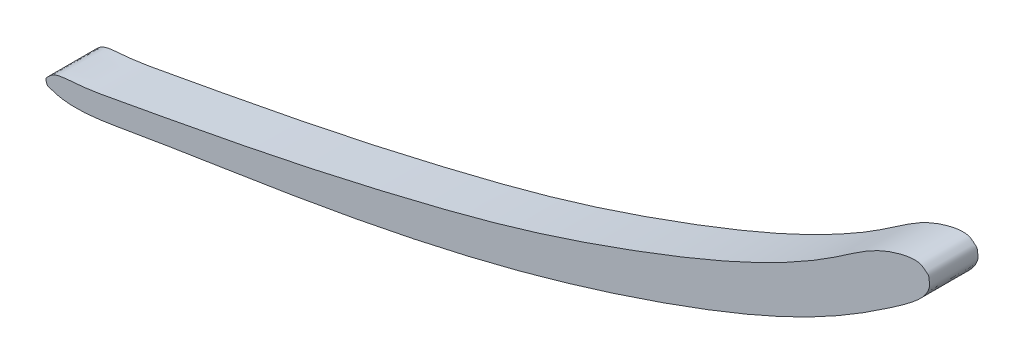
ISO-10303-21;
HEADER;
FILE_DESCRIPTION(('STEP AP214'),'2;1');
FILE_NAME('part.step','',(''),(''),'','','');
FILE_SCHEMA(('AUTOMOTIVE_DESIGN { 1 0 10303 214 1 1 1 1 }'));
ENDSEC;
DATA;
#1=APPLICATION_CONTEXT('core data for automotive mechanical design processes');
#2=APPLICATION_PROTOCOL_DEFINITION('international standard','automotive_design',2000,#1);
#3=PRODUCT_CONTEXT('',#1,'mechanical');
#4=PRODUCT('Part','Part','',(#3));
#5=PRODUCT_RELATED_PRODUCT_CATEGORY('part','',(#4));
#6=PRODUCT_DEFINITION_FORMATION('','',#4);
#7=PRODUCT_DEFINITION_CONTEXT('part definition',#1,'design');
#8=PRODUCT_DEFINITION('design','',#6,#7);
#9=PRODUCT_DEFINITION_SHAPE('','',#8);
#10=(LENGTH_UNIT() NAMED_UNIT(*) SI_UNIT(.MILLI.,.METRE.));
#11=(NAMED_UNIT(*) PLANE_ANGLE_UNIT() SI_UNIT($,.RADIAN.));
#12=(NAMED_UNIT(*) SI_UNIT($,.STERADIAN.) SOLID_ANGLE_UNIT());
#13=UNCERTAINTY_MEASURE_WITH_UNIT(LENGTH_MEASURE(1.E-05),#10,'distance_accuracy_value','');
#14=(GEOMETRIC_REPRESENTATION_CONTEXT(3) GLOBAL_UNCERTAINTY_ASSIGNED_CONTEXT((#13)) GLOBAL_UNIT_ASSIGNED_CONTEXT((#10,
#11,#12)) REPRESENTATION_CONTEXT('',''));
#15=CARTESIAN_POINT('',(0.,0.,0.));
#16=DIRECTION('',(0.,0.,1.));
#17=DIRECTION('',(1.,0.,0.));
#18=AXIS2_PLACEMENT_3D('',#15,#16,#17);
#19=CARTESIAN_POINT('',(87.7911264465302,0.,284.));
#20=CARTESIAN_POINT('',(87.7481802815542,0.0962454189337628,284.));
#21=CARTESIAN_POINT('',(87.6727492096745,0.169728571092153,284.));
#22=CARTESIAN_POINT('',(87.5172440227776,0.307677345707682,284.));
#23=CARTESIAN_POINT('',(87.4355212373693,0.371873642471074,284.));
#24=CARTESIAN_POINT('',(87.1945555788236,0.569520441860992,284.));
#25=CARTESIAN_POINT('',(87.0341075621391,0.703455505464668,284.));
#26=CARTESIAN_POINT('',(86.7749901315386,0.872581566845885,284.));
#27=CARTESIAN_POINT('',(86.6859340509412,0.924023199593632,284.));
#28=CARTESIAN_POINT('',(86.4983624308674,1.00951554748678,284.));
#29=CARTESIAN_POINT('',(86.3992700129601,1.04439164367753,284.));
#30=CARTESIAN_POINT('',(86.0973034683932,1.12595188193195,284.));
#31=CARTESIAN_POINT('',(85.8923822435028,1.15014240309523,284.));
#32=CARTESIAN_POINT('',(85.4790369268136,1.16923779046575,284.));
#33=CARTESIAN_POINT('',(85.2702782794097,1.16315432469909,284.));
#34=CARTESIAN_POINT('',(84.8583321882338,1.13593622673709,284.));
#35=CARTESIAN_POINT('',(84.6538779211453,1.11404091212217,284.));
#36=CARTESIAN_POINT('',(84.0445265002724,1.02646937830722,284.));
#37=CARTESIAN_POINT('',(83.6432524861405,0.941025762084078,284.));
#38=CARTESIAN_POINT('',(82.8454195479297,0.74441358773097,284.));
#39=CARTESIAN_POINT('',(82.4480527517343,0.630956943376031,284.));
#40=CARTESIAN_POINT('',(81.6643294590283,0.380184167042348,284.));
#41=CARTESIAN_POINT('',(81.2781670580512,0.243486501204399,284.));
#42=CARTESIAN_POINT('',(80.1358219979057,-0.198643765670282,284.));
#43=CARTESIAN_POINT('',(79.3963873198248,-0.53731604178987,284.));
#44=CARTESIAN_POINT('',(77.2413726302807,-1.67894307014875,284.));
#45=CARTESIAN_POINT('',(75.8829701527257,-2.59549395366934,284.));
#46=CARTESIAN_POINT('',(73.8531163770944,-3.98521857576905,284.));
#47=CARTESIAN_POINT('',(73.176819308916,-4.44908747541689,284.));
#48=CARTESIAN_POINT('',(71.8154731879832,-5.35971286859955,284.));
#49=CARTESIAN_POINT('',(71.1309730345465,-5.80754260306145,284.));
#50=CARTESIAN_POINT('',(69.0581291794071,-7.11321043861303,284.));
#51=CARTESIAN_POINT('',(67.6518579672875,-7.93599559414653,284.));
#52=CARTESIAN_POINT('',(64.8071071174064,-9.51859005612932,284.));
#53=CARTESIAN_POINT('',(63.3687143626986,-10.2785692415455,284.));
#54=CARTESIAN_POINT('',(60.4684597166121,-11.7526393461967,284.));
#55=CARTESIAN_POINT('',(59.0055938368001,-12.4647672069216,284.));
#56=CARTESIAN_POINT('',(56.0548287125209,-13.840076189647,284.));
#57=CARTESIAN_POINT('',(54.5674709906446,-14.5043161291555,284.));
#58=CARTESIAN_POINT('',(50.0779884647125,-16.4434435195022,284.));
#59=CARTESIAN_POINT('',(47.0485629750527,-17.6672711525936,284.));
#60=CARTESIAN_POINT('',(40.9503992978474,-20.027855087057,284.));
#61=CARTESIAN_POINT('',(37.8831735852103,-21.1613695221191,284.));
#62=CARTESIAN_POINT('',(31.7209300282654,-23.3469929076171,284.));
#63=CARTESIAN_POINT('',(28.626393638109,-24.3995761228498,284.));
#64=CARTESIAN_POINT('',(22.401522803712,-26.397389373977,284.));
#65=CARTESIAN_POINT('',(19.2692932597399,-27.3393494810802,284.));
#66=CARTESIAN_POINT('',(12.9766083097691,-29.1125817228828,284.));
#67=CARTESIAN_POINT('',(9.81522470766044,-29.943670989211,284.));
#68=CARTESIAN_POINT('',(3.47478984366053,-31.5406263795226,284.));
#69=CARTESIAN_POINT('',(0.296795037230864,-32.3094107242285,284.));
#70=CARTESIAN_POINT('',(-6.06805816102918,-33.8061487754712,284.));
#71=CARTESIAN_POINT('',(-9.25578981244472,-34.5320259068556,284.));
#72=CARTESIAN_POINT('',(-15.6432351040825,-35.9315694473391,284.));
#73=CARTESIAN_POINT('',(-18.8429164033899,-36.6023046551761,284.));
#74=CARTESIAN_POINT('',(-25.2518725848249,-37.8970254709975,284.));
#75=CARTESIAN_POINT('',(-28.4613496217697,-38.5202780970065,284.));
#76=CARTESIAN_POINT('',(-34.884421368021,-39.745234445585,284.));
#77=CARTESIAN_POINT('',(-38.0972858342066,-40.3507546147087,284.));
#78=CARTESIAN_POINT('',(-42.9181799896329,-41.2504622280306,284.));
#79=CARTESIAN_POINT('',(-44.5256948073398,-41.5474214828522,284.));
#80=CARTESIAN_POINT('',(-46.9383881405735,-41.9850412282747,284.));
#81=CARTESIAN_POINT('',(-47.7425554753095,-42.1312737573604,284.));
#82=CARTESIAN_POINT('',(-49.3524847012347,-42.4147559670251,284.));
#83=CARTESIAN_POINT('',(-50.1589951855724,-42.549340602634,284.));
#84=CARTESIAN_POINT('',(-51.777821428546,-42.7706849364089,284.));
#85=CARTESIAN_POINT('',(-52.5903945283799,-42.857653679498,284.));
#86=CARTESIAN_POINT('',(-53.813915042754,-42.9463891695607,284.));
#87=CARTESIAN_POINT('',(-54.2222315715208,-42.9710524551828,284.));
#88=CARTESIAN_POINT('',(-55.0360105960984,-43.0498278752384,284.));
#89=CARTESIAN_POINT('',(-55.4441786272754,-43.1010762668659,284.));
#90=CARTESIAN_POINT('',(-56.0416227160051,-43.235819193569,284.));
#91=CARTESIAN_POINT('',(-56.2376171692656,-43.2910366378839,284.));
#92=CARTESIAN_POINT('',(-56.6190885552686,-43.4358336053908,284.));
#93=CARTESIAN_POINT('',(-56.8060953882609,-43.5275394067041,284.));
#94=CARTESIAN_POINT('',(-57.1472820761515,-43.749285223365,284.));
#95=CARTESIAN_POINT('',(-57.3057247181236,-43.8761669570005,284.));
#96=CARTESIAN_POINT('',(-57.5330254416279,-44.0801433603682,284.));
#97=CARTESIAN_POINT('',(-57.6079669018952,-44.1492230407071,284.));
#98=CARTESIAN_POINT('',(-57.7557929166093,-44.2900924214332,284.));
#99=CARTESIAN_POINT('',(-57.8290283581648,-44.362014536336,284.));
#100=CARTESIAN_POINT('',(-57.9202984541998,-44.4850103776025,284.));
#101=CARTESIAN_POINT('',(-57.946647171544,-44.5283926866849,284.));
#102=CARTESIAN_POINT('',(-57.9840163027178,-44.6241244611418,284.));
#103=CARTESIAN_POINT('',(-57.9931587736318,-44.6739788520515,284.));
#104=CARTESIAN_POINT('',(-58.0004128725855,-44.8262478458151,284.));
#105=CARTESIAN_POINT('',(-57.9794572285707,-44.9263775248347,284.));
#106=CARTESIAN_POINT('',(-57.9287686186488,-45.1216028957495,284.));
#107=CARTESIAN_POINT('',(-57.8984076862506,-45.2186429516076,284.));
#108=CARTESIAN_POINT('',(-57.8183670632836,-45.4035866170413,284.));
#109=CARTESIAN_POINT('',(-57.7648301816809,-45.4923137567089,284.));
#110=CARTESIAN_POINT('',(-57.6091435313676,-45.6237381852392,284.));
#111=CARTESIAN_POINT('',(-57.5118315938044,-45.6587678613877,284.));
#112=CARTESIAN_POINT('',(-57.3165110887453,-45.7127680634603,284.));
#113=CARTESIAN_POINT('',(-57.2172459054305,-45.733861425657,284.));
#114=CARTESIAN_POINT('',(-56.9226881880655,-45.8090579335832,284.));
#115=CARTESIAN_POINT('',(-56.7288966190067,-45.8686038545298,284.));
#116=CARTESIAN_POINT('',(-56.3406366409915,-45.9865659482261,284.));
#117=CARTESIAN_POINT('',(-56.146304675394,-46.0443781035023,284.));
#118=CARTESIAN_POINT('',(-55.7542816115856,-46.1405622313922,284.));
#119=CARTESIAN_POINT('',(-55.5566832833803,-46.1794710883932,284.));
#120=CARTESIAN_POINT('',(-54.9606528505863,-46.2774732710465,284.));
#121=CARTESIAN_POINT('',(-54.5588471251529,-46.3170425668369,284.));
#122=CARTESIAN_POINT('',(-53.7508735411669,-46.3709363484042,284.));
#123=CARTESIAN_POINT('',(-53.3449743078015,-46.3839239661267,284.));
#124=CARTESIAN_POINT('',(-52.5368836854447,-46.3844207367432,284.));
#125=CARTESIAN_POINT('',(-52.1336497430408,-46.3719350193046,284.));
#126=CARTESIAN_POINT('',(-50.925956678883,-46.3029511482796,284.));
#127=CARTESIAN_POINT('',(-50.1234359718298,-46.2160303647601,284.));
#128=CARTESIAN_POINT('',(-48.520569832823,-46.0080487402143,284.));
#129=CARTESIAN_POINT('',(-47.7208321084178,-45.8860141583429,284.));
#130=CARTESIAN_POINT('',(-45.3260353818469,-45.4998905100312,284.));
#131=CARTESIAN_POINT('',(-43.7331065288849,-45.2201659675351,284.));
#132=CARTESIAN_POINT('',(-40.5445232382469,-44.6777108905389,284.));
#133=CARTESIAN_POINT('',(-38.9492833176896,-44.4121576126717,284.));
#134=CARTESIAN_POINT('',(-34.1594892268408,-43.6398776265155,284.));
#135=CARTESIAN_POINT('',(-30.9625400992213,-43.1483441093621,284.));
#136=CARTESIAN_POINT('',(-24.5704991468352,-42.1539847990273,284.));
#137=CARTESIAN_POINT('',(-21.3756268702745,-41.6497360468942,284.));
#138=CARTESIAN_POINT('',(-11.8027012823728,-40.0650105636547,284.));
#139=CARTESIAN_POINT('',(-5.43640756123258,-38.9107131809707,284.));
#140=CARTESIAN_POINT('',(4.06494030611311,-36.9479231420941,284.));
#141=CARTESIAN_POINT('',(7.22510910992042,-36.25503294453,284.));
#142=CARTESIAN_POINT('',(13.5244825871753,-34.7852703051894,284.));
#143=CARTESIAN_POINT('',(16.6633154114312,-34.0081260198608,284.));
#144=CARTESIAN_POINT('',(26.0408023728531,-31.524790162999,284.));
#145=CARTESIAN_POINT('',(32.246315924874,-29.6734864116683,284.));
#146=CARTESIAN_POINT('',(41.4562057340632,-26.6269466981335,284.));
#147=CARTESIAN_POINT('',(44.5086593890241,-25.5696736713116,284.));
#148=CARTESIAN_POINT('',(50.5717545042218,-23.3554070669072,284.));
#149=CARTESIAN_POINT('',(53.5830028031964,-22.1998607774559,284.));
#150=CARTESIAN_POINT('',(59.5468781188795,-19.7489585905567,284.));
#151=CARTESIAN_POINT('',(62.4988749848173,-18.452099806635,284.));
#152=CARTESIAN_POINT('',(66.8588330562178,-16.3445453387313,284.));
#153=CARTESIAN_POINT('',(68.3007930755015,-15.6149355786482,284.));
#154=CARTESIAN_POINT('',(71.1590228654491,-14.0944457578333,284.));
#155=CARTESIAN_POINT('',(72.576041902853,-13.3028228846042,284.));
#156=CARTESIAN_POINT('',(76.7800667858006,-10.8324213266139,284.));
#157=CARTESIAN_POINT('',(79.5105146402641,-9.06565635428191,284.));
#158=CARTESIAN_POINT('',(82.8438461187872,-6.74130873990036,284.));
#159=CARTESIAN_POINT('',(83.5065012010157,-6.27076108851625,284.));
#160=CARTESIAN_POINT('',(84.4844669951782,-5.54303085623904,284.));
#161=CARTESIAN_POINT('',(84.8073530707023,-5.2957916638373,284.));
#162=CARTESIAN_POINT('',(85.4405158119561,-4.78722641032446,284.));
#163=CARTESIAN_POINT('',(85.7515547993907,-4.52661883728521,284.));
#164=CARTESIAN_POINT('',(86.3488844909767,-3.97716104595352,284.));
#165=CARTESIAN_POINT('',(86.6365878181175,-3.68670555501245,284.));
#166=CARTESIAN_POINT('',(87.1599248605686,-3.06593059594548,284.));
#167=CARTESIAN_POINT('',(87.3954148670015,-2.73273012157544,284.));
#168=CARTESIAN_POINT('',(87.6823289237327,-2.19283332109273,284.));
#169=CARTESIAN_POINT('',(87.7664726231092,-2.00786788775967,284.));
#170=CARTESIAN_POINT('',(87.8950944765127,-1.62068318463549,284.));
#171=CARTESIAN_POINT('',(87.9392571222891,-1.41973494641334,284.));
#172=CARTESIAN_POINT('',(87.9515493767395,-1.0158303448488,284.));
#173=CARTESIAN_POINT('',(87.91711233327,-0.811011086769602,284.));
#174=CARTESIAN_POINT('',(87.8706349132654,-0.506766174180878,284.));
#175=CARTESIAN_POINT('',(87.8595671022276,-0.404683686824204,284.));
#176=CARTESIAN_POINT('',(87.8397268043005,-0.200172433316026,284.));
#177=CARTESIAN_POINT('',(87.8340726115061,-0.0962454189337527,284.));
#178=CARTESIAN_POINT('',(87.7911264465302,0.,284.));
#179=B_SPLINE_CURVE_WITH_KNOTS('',3,(#19,#20,#21,#22,#23,#24,#25,#26,#27,#28,#29,#30,#31,#32,
#33,#34,#35,#36,#37,#38,#39,#40,#41,#42,#43,#44,#45,#46,#47,#48,#49,#50,#51,#52,#53,#54,#55,#56,
#57,#58,#59,#60,#61,#62,#63,#64,#65,#66,#67,#68,#69,#70,#71,#72,#73,#74,#75,#76,#77,#78,#79,#80,
#81,#82,#83,#84,#85,#86,#87,#88,#89,#90,#91,#92,#93,#94,#95,#96,#97,#98,#99,#100,#101,#102,#103,
#104,#105,#106,#107,#108,#109,#110,#111,#112,#113,#114,#115,#116,#117,#118,#119,#120,#121,#122,
#123,#124,#125,#126,#127,#128,#129,#130,#131,#132,#133,#134,#135,#136,#137,#138,#139,#140,#141,
#142,#143,#144,#145,#146,#147,#148,#149,#150,#151,#152,#153,#154,#155,#156,#157,#158,#159,#160,
#161,#162,#163,#164,#165,#166,#167,#168,#169,#170,#171,#172,#173,#174,#175,#176,#177,#178),
.UNSPECIFIED.,.T.,.F.,(4,2,2,2,2,2,2,2,2,2,2,2,2,2,2,2,2,2,2,2,2,2,2,2,2,2,2,2,2,2,2,2,2,2,2,2,
2,2,2,2,2,2,2,2,2,2,2,2,2,2,2,2,2,2,2,2,2,2,2,2,2,2,2,2,2,2,2,2,2,2,2,2,2,2,2,2,2,2,2,4),(0.,
0.000976562500000109,0.00195312500000022,0.00390625000000043,0.00488281250000054,
0.00585937500000065,0.00781250000000074,0.00976562500000084,0.0117187500000009,
0.0156250000000011,0.0195312500000013,0.0234375000000015,0.0312500000000019,0.0468750000000026,
0.054687500000003,0.0625000000000034,0.0781250000000043,0.0937500000000051,0.109375000000006,
0.125000000000007,0.156250000000009,0.187500000000011,0.218750000000012,0.250000000000014,
0.281250000000016,0.312500000000018,0.34375000000002,0.375000000000021,0.406250000000023,
0.437500000000025,0.453125000000026,0.460937500000026,0.468750000000027,0.476562500000027,
0.480468750000028,0.484375000000028,0.486328125000028,0.488281250000028,0.490234375000028,
0.491210937500028,0.492187500000028,0.492675781250028,0.493164062500028,0.494140625000028,
0.495117187500028,0.496093750000028,0.497070312500028,0.498046875000028,0.500000000000028,
0.501953125000028,0.503906250000028,0.507812500000028,0.511718750000028,0.515625000000027,
0.523437500000027,0.531250000000026,0.546875000000025,0.562500000000025,0.593750000000023,
0.625000000000021,0.687500000000018,0.718750000000016,0.750000000000014,0.812500000000011,
0.843750000000009,0.875000000000007,0.906250000000005,0.921875000000004,0.937500000000003,
0.968750000000002,0.976562500000001,0.980468750000001,0.984375000000001,0.988281250000001,
0.9921875,0.994140625,0.99609375,0.998046875,0.9990234375,1.),.UNSPECIFIED.);
#180=DIRECTION('',(0.,0.,-1.));
#181=VECTOR('',#180,1.);
#182=SURFACE_OF_LINEAR_EXTRUSION('',#179,#181);
#183=CARTESIAN_POINT('',(87.7911264465302,0.,284.));
#184=CARTESIAN_POINT('',(87.8340726115061,-0.0962454189337527,284.));
#185=CARTESIAN_POINT('',(87.8397268043005,-0.200172433316026,284.));
#186=CARTESIAN_POINT('',(87.8595671022276,-0.404683686824204,284.));
#187=CARTESIAN_POINT('',(87.8706349132654,-0.506766174180878,284.));
#188=CARTESIAN_POINT('',(87.91711233327,-0.811011086769602,284.));
#189=CARTESIAN_POINT('',(87.9515493767395,-1.0158303448488,284.));
#190=CARTESIAN_POINT('',(87.9392571222891,-1.41973494641334,284.));
#191=CARTESIAN_POINT('',(87.8950944765127,-1.62068318463549,284.));
#192=CARTESIAN_POINT('',(87.7664726231092,-2.00786788775967,284.));
#193=CARTESIAN_POINT('',(87.6823289237327,-2.19283332109273,284.));
#194=CARTESIAN_POINT('',(87.3954148670015,-2.73273012157544,284.));
#195=CARTESIAN_POINT('',(87.1599248605686,-3.06593059594548,284.));
#196=CARTESIAN_POINT('',(86.6365878181175,-3.68670555501245,284.));
#197=CARTESIAN_POINT('',(86.3488844909767,-3.97716104595352,284.));
#198=CARTESIAN_POINT('',(85.7515547993907,-4.52661883728521,284.));
#199=CARTESIAN_POINT('',(85.4405158119561,-4.78722641032446,284.));
#200=CARTESIAN_POINT('',(84.8073530707023,-5.2957916638373,284.));
#201=CARTESIAN_POINT('',(84.4844669951782,-5.54303085623904,284.));
#202=CARTESIAN_POINT('',(83.5065012010157,-6.27076108851625,284.));
#203=CARTESIAN_POINT('',(82.8438461187872,-6.74130873990036,284.));
#204=CARTESIAN_POINT('',(79.5105146402641,-9.06565635428191,284.));
#205=CARTESIAN_POINT('',(76.7800667858006,-10.8324213266139,284.));
#206=CARTESIAN_POINT('',(72.576041902853,-13.3028228846042,284.));
#207=CARTESIAN_POINT('',(71.1590228654491,-14.0944457578333,284.));
#208=CARTESIAN_POINT('',(68.3007930755015,-15.6149355786482,284.));
#209=CARTESIAN_POINT('',(66.8588330562178,-16.3445453387313,284.));
#210=CARTESIAN_POINT('',(62.4988749848173,-18.452099806635,284.));
#211=CARTESIAN_POINT('',(59.5468781188795,-19.7489585905567,284.));
#212=CARTESIAN_POINT('',(53.5830028031964,-22.1998607774559,284.));
#213=CARTESIAN_POINT('',(50.5717545042218,-23.3554070669072,284.));
#214=CARTESIAN_POINT('',(44.5086593890241,-25.5696736713116,284.));
#215=CARTESIAN_POINT('',(41.4562057340632,-26.6269466981335,284.));
#216=CARTESIAN_POINT('',(32.246315924874,-29.6734864116683,284.));
#217=CARTESIAN_POINT('',(26.0408023728531,-31.524790162999,284.));
#218=CARTESIAN_POINT('',(16.6633154114312,-34.0081260198608,284.));
#219=CARTESIAN_POINT('',(13.5244825871753,-34.7852703051894,284.));
#220=CARTESIAN_POINT('',(7.22510910992042,-36.25503294453,284.));
#221=CARTESIAN_POINT('',(4.06494030611311,-36.9479231420941,284.));
#222=CARTESIAN_POINT('',(-5.43640756123258,-38.9107131809707,284.));
#223=CARTESIAN_POINT('',(-11.8027012823728,-40.0650105636547,284.));
#224=CARTESIAN_POINT('',(-21.3756268702745,-41.6497360468942,284.));
#225=CARTESIAN_POINT('',(-24.5704991468352,-42.1539847990273,284.));
#226=CARTESIAN_POINT('',(-30.9625400992213,-43.1483441093621,284.));
#227=CARTESIAN_POINT('',(-34.1594892268408,-43.6398776265155,284.));
#228=CARTESIAN_POINT('',(-38.9492833176896,-44.4121576126717,284.));
#229=CARTESIAN_POINT('',(-40.5445232382469,-44.6777108905389,284.));
#230=CARTESIAN_POINT('',(-43.7331065288849,-45.2201659675351,284.));
#231=CARTESIAN_POINT('',(-45.3260353818469,-45.4998905100312,284.));
#232=CARTESIAN_POINT('',(-47.7208321084178,-45.8860141583429,284.));
#233=CARTESIAN_POINT('',(-48.520569832823,-46.0080487402143,284.));
#234=CARTESIAN_POINT('',(-50.1234359718298,-46.2160303647601,284.));
#235=CARTESIAN_POINT('',(-50.925956678883,-46.3029511482796,284.));
#236=CARTESIAN_POINT('',(-52.1336497430408,-46.3719350193046,284.));
#237=CARTESIAN_POINT('',(-52.5368836854447,-46.3844207367432,284.));
#238=CARTESIAN_POINT('',(-53.3449743078015,-46.3839239661267,284.));
#239=CARTESIAN_POINT('',(-53.7508735411669,-46.3709363484042,284.));
#240=CARTESIAN_POINT('',(-54.5588471251529,-46.3170425668369,284.));
#241=CARTESIAN_POINT('',(-54.9606528505863,-46.2774732710465,284.));
#242=CARTESIAN_POINT('',(-55.5566832833803,-46.1794710883932,284.));
#243=CARTESIAN_POINT('',(-55.7542816115856,-46.1405622313922,284.));
#244=CARTESIAN_POINT('',(-56.146304675394,-46.0443781035023,284.));
#245=CARTESIAN_POINT('',(-56.3406366409915,-45.9865659482261,284.));
#246=CARTESIAN_POINT('',(-56.7288966190067,-45.8686038545298,284.));
#247=CARTESIAN_POINT('',(-56.9226881880655,-45.8090579335832,284.));
#248=CARTESIAN_POINT('',(-57.2172459054305,-45.733861425657,284.));
#249=CARTESIAN_POINT('',(-57.3165110887453,-45.7127680634603,284.));
#250=CARTESIAN_POINT('',(-57.5118315938044,-45.6587678613877,284.));
#251=CARTESIAN_POINT('',(-57.6091435313676,-45.6237381852392,284.));
#252=CARTESIAN_POINT('',(-57.7648301816809,-45.4923137567089,284.));
#253=CARTESIAN_POINT('',(-57.8183670632836,-45.4035866170413,284.));
#254=CARTESIAN_POINT('',(-57.8984076862506,-45.2186429516076,284.));
#255=CARTESIAN_POINT('',(-57.9287686186488,-45.1216028957495,284.));
#256=CARTESIAN_POINT('',(-57.9794572285707,-44.9263775248347,284.));
#257=CARTESIAN_POINT('',(-58.0004128725855,-44.8262478458151,284.));
#258=CARTESIAN_POINT('',(-57.9931587736318,-44.6739788520515,284.));
#259=CARTESIAN_POINT('',(-57.9840163027178,-44.6241244611418,284.));
#260=CARTESIAN_POINT('',(-57.946647171544,-44.5283926866849,284.));
#261=CARTESIAN_POINT('',(-57.9202984541998,-44.4850103776025,284.));
#262=CARTESIAN_POINT('',(-57.8290283581648,-44.362014536336,284.));
#263=CARTESIAN_POINT('',(-57.7557929166093,-44.2900924214332,284.));
#264=CARTESIAN_POINT('',(-57.6079669018952,-44.1492230407071,284.));
#265=CARTESIAN_POINT('',(-57.5330254416279,-44.0801433603682,284.));
#266=CARTESIAN_POINT('',(-57.3057247181236,-43.8761669570005,284.));
#267=CARTESIAN_POINT('',(-57.1472820761515,-43.749285223365,284.));
#268=CARTESIAN_POINT('',(-56.8060953882609,-43.5275394067041,284.));
#269=CARTESIAN_POINT('',(-56.6190885552686,-43.4358336053908,284.));
#270=CARTESIAN_POINT('',(-56.2376171692656,-43.2910366378839,284.));
#271=CARTESIAN_POINT('',(-56.0416227160051,-43.235819193569,284.));
#272=CARTESIAN_POINT('',(-55.4441786272754,-43.1010762668659,284.));
#273=CARTESIAN_POINT('',(-55.0360105960984,-43.0498278752384,284.));
#274=CARTESIAN_POINT('',(-54.2222315715208,-42.9710524551828,284.));
#275=CARTESIAN_POINT('',(-53.813915042754,-42.9463891695607,284.));
#276=CARTESIAN_POINT('',(-52.5903945283799,-42.857653679498,284.));
#277=CARTESIAN_POINT('',(-51.777821428546,-42.7706849364089,284.));
#278=CARTESIAN_POINT('',(-50.1589951855724,-42.549340602634,284.));
#279=CARTESIAN_POINT('',(-49.3524847012347,-42.4147559670251,284.));
#280=CARTESIAN_POINT('',(-47.7425554753095,-42.1312737573604,284.));
#281=CARTESIAN_POINT('',(-46.9383881405735,-41.9850412282747,284.));
#282=CARTESIAN_POINT('',(-44.5256948073398,-41.5474214828522,284.));
#283=CARTESIAN_POINT('',(-42.9181799896329,-41.2504622280306,284.));
#284=CARTESIAN_POINT('',(-38.0972858342066,-40.3507546147087,284.));
#285=CARTESIAN_POINT('',(-34.884421368021,-39.745234445585,284.));
#286=CARTESIAN_POINT('',(-28.4613496217697,-38.5202780970065,284.));
#287=CARTESIAN_POINT('',(-25.2518725848249,-37.8970254709975,284.));
#288=CARTESIAN_POINT('',(-18.8429164033899,-36.6023046551761,284.));
#289=CARTESIAN_POINT('',(-15.6432351040825,-35.9315694473391,284.));
#290=CARTESIAN_POINT('',(-9.25578981244472,-34.5320259068556,284.));
#291=CARTESIAN_POINT('',(-6.06805816102918,-33.8061487754712,284.));
#292=CARTESIAN_POINT('',(0.296795037230864,-32.3094107242285,284.));
#293=CARTESIAN_POINT('',(3.47478984366053,-31.5406263795226,284.));
#294=CARTESIAN_POINT('',(9.81522470766044,-29.943670989211,284.));
#295=CARTESIAN_POINT('',(12.9766083097691,-29.1125817228828,284.));
#296=CARTESIAN_POINT('',(19.2692932597399,-27.3393494810802,284.));
#297=CARTESIAN_POINT('',(22.401522803712,-26.397389373977,284.));
#298=CARTESIAN_POINT('',(28.626393638109,-24.3995761228498,284.));
#299=CARTESIAN_POINT('',(31.7209300282654,-23.3469929076171,284.));
#300=CARTESIAN_POINT('',(37.8831735852103,-21.1613695221191,284.));
#301=CARTESIAN_POINT('',(40.9503992978474,-20.027855087057,284.));
#302=CARTESIAN_POINT('',(47.0485629750527,-17.6672711525936,284.));
#303=CARTESIAN_POINT('',(50.0779884647125,-16.4434435195022,284.));
#304=CARTESIAN_POINT('',(54.5674709906446,-14.5043161291555,284.));
#305=CARTESIAN_POINT('',(56.0548287125209,-13.840076189647,284.));
#306=CARTESIAN_POINT('',(59.0055938368001,-12.4647672069216,284.));
#307=CARTESIAN_POINT('',(60.4684597166121,-11.7526393461967,284.));
#308=CARTESIAN_POINT('',(63.3687143626986,-10.2785692415455,284.));
#309=CARTESIAN_POINT('',(64.8071071174064,-9.51859005612932,284.));
#310=CARTESIAN_POINT('',(67.6518579672875,-7.93599559414653,284.));
#311=CARTESIAN_POINT('',(69.0581291794071,-7.11321043861303,284.));
#312=CARTESIAN_POINT('',(71.1309730345465,-5.80754260306145,284.));
#313=CARTESIAN_POINT('',(71.8154731879832,-5.35971286859955,284.));
#314=CARTESIAN_POINT('',(73.176819308916,-4.44908747541689,284.));
#315=CARTESIAN_POINT('',(73.8531163770944,-3.98521857576905,284.));
#316=CARTESIAN_POINT('',(75.8829701527257,-2.59549395366934,284.));
#317=CARTESIAN_POINT('',(77.2413726302807,-1.67894307014875,284.));
#318=CARTESIAN_POINT('',(79.3963873198248,-0.53731604178987,284.));
#319=CARTESIAN_POINT('',(80.1358219979057,-0.198643765670282,284.));
#320=CARTESIAN_POINT('',(81.2781670580512,0.243486501204399,284.));
#321=CARTESIAN_POINT('',(81.6643294590283,0.380184167042348,284.));
#322=CARTESIAN_POINT('',(82.4480527517343,0.630956943376031,284.));
#323=CARTESIAN_POINT('',(82.8454195479297,0.74441358773097,284.));
#324=CARTESIAN_POINT('',(83.6432524861405,0.941025762084078,284.));
#325=CARTESIAN_POINT('',(84.0445265002724,1.02646937830722,284.));
#326=CARTESIAN_POINT('',(84.6538779211453,1.11404091212217,284.));
#327=CARTESIAN_POINT('',(84.8583321882338,1.13593622673709,284.));
#328=CARTESIAN_POINT('',(85.2702782794097,1.16315432469909,284.));
#329=CARTESIAN_POINT('',(85.4790369268136,1.16923779046575,284.));
#330=CARTESIAN_POINT('',(85.8923822435028,1.15014240309523,284.));
#331=CARTESIAN_POINT('',(86.0973034683932,1.12595188193195,284.));
#332=CARTESIAN_POINT('',(86.3992700129601,1.04439164367753,284.));
#333=CARTESIAN_POINT('',(86.4983624308674,1.00951554748678,284.));
#334=CARTESIAN_POINT('',(86.6859340509412,0.924023199593632,284.));
#335=CARTESIAN_POINT('',(86.7749901315386,0.872581566845885,284.));
#336=CARTESIAN_POINT('',(87.0341075621391,0.703455505464668,284.));
#337=CARTESIAN_POINT('',(87.1945555788236,0.569520441860992,284.));
#338=CARTESIAN_POINT('',(87.4355212373693,0.371873642471074,284.));
#339=CARTESIAN_POINT('',(87.5172440227776,0.307677345707682,284.));
#340=CARTESIAN_POINT('',(87.6727492096745,0.169728571092153,284.));
#341=CARTESIAN_POINT('',(87.7481802815542,0.0962454189337628,284.));
#342=CARTESIAN_POINT('',(87.7911264465302,0.,284.));
#343=B_SPLINE_CURVE_WITH_KNOTS('',3,(#183,#184,#185,#186,#187,#188,#189,#190,#191,#192,#193,
#194,#195,#196,#197,#198,#199,#200,#201,#202,#203,#204,#205,#206,#207,#208,#209,#210,#211,#212,
#213,#214,#215,#216,#217,#218,#219,#220,#221,#222,#223,#224,#225,#226,#227,#228,#229,#230,#231,
#232,#233,#234,#235,#236,#237,#238,#239,#240,#241,#242,#243,#244,#245,#246,#247,#248,#249,#250,
#251,#252,#253,#254,#255,#256,#257,#258,#259,#260,#261,#262,#263,#264,#265,#266,#267,#268,#269,
#270,#271,#272,#273,#274,#275,#276,#277,#278,#279,#280,#281,#282,#283,#284,#285,#286,#287,#288,
#289,#290,#291,#292,#293,#294,#295,#296,#297,#298,#299,#300,#301,#302,#303,#304,#305,#306,#307,
#308,#309,#310,#311,#312,#313,#314,#315,#316,#317,#318,#319,#320,#321,#322,#323,#324,#325,#326,
#327,#328,#329,#330,#331,#332,#333,#334,#335,#336,#337,#338,#339,#340,#341,#342),.UNSPECIFIED.,
.T.,.F.,(4,2,2,2,2,2,2,2,2,2,2,2,2,2,2,2,2,2,2,2,2,2,2,2,2,2,2,2,2,2,2,2,2,2,2,2,2,2,2,2,2,2,2,
2,2,2,2,2,2,2,2,2,2,2,2,2,2,2,2,2,2,2,2,2,2,2,2,2,2,2,2,2,2,2,2,2,2,2,2,4),(0.,
0.000976562499999889,0.00195312499999989,0.00390624999999978,0.00585937499999967,
0.00781249999999956,0.0117187499999994,0.0156249999999993,0.0195312499999991,0.0234374999999988,
0.0312499999999983,0.0624999999999966,0.0781249999999956,0.0937499999999947,0.124999999999993,
0.156249999999991,0.187499999999989,0.249999999999986,0.281249999999984,0.312499999999982,
0.374999999999979,0.406249999999977,0.437499999999975,0.453124999999975,0.468749999999974,
0.476562499999973,0.484374999999973,0.488281249999972,0.492187499999972,0.496093749999972,
0.498046874999972,0.499999999999972,0.501953124999972,0.502929687499972,0.503906249999972,
0.504882812499972,0.505859374999972,0.506835937499972,0.507324218749972,0.507812499999972,
0.508789062499972,0.509765624999972,0.511718749999972,0.513671874999972,0.515624999999972,
0.519531249999972,0.523437499999973,0.531249999999973,0.539062499999974,0.546874999999974,
0.562499999999975,0.593749999999977,0.624999999999979,0.65624999999998,0.687499999999982,
0.718749999999984,0.749999999999986,0.781249999999988,0.812499999999989,0.843749999999991,
0.874999999999993,0.890624999999994,0.906249999999995,0.921874999999996,0.937499999999997,
0.945312499999997,0.953124999999997,0.968749999999998,0.976562499999999,0.980468749999999,
0.984374999999999,0.988281249999999,0.990234374999999,0.992187499999999,0.994140624999999,
0.995117187499999,0.99609375,0.998046875,0.9990234375,1.),.UNSPECIFIED.);
#344=CARTESIAN_POINT('',(87.7911264465302,0.,284.));
#345=VERTEX_POINT('',#344);
#346=EDGE_CURVE('E10',#345,#345,#343,.F.);
#347=ORIENTED_EDGE('',*,*,#346,.F.);
#348=EDGE_LOOP('',(#347));
#349=FACE_BOUND('',#348,.T.);
#350=CARTESIAN_POINT('',(87.7911264465302,0.,276.));
#351=CARTESIAN_POINT('',(87.7481802815542,0.0962454189337628,276.));
#352=CARTESIAN_POINT('',(87.6727492096745,0.169728571092153,276.));
#353=CARTESIAN_POINT('',(87.5172440227776,0.307677345707682,276.));
#354=CARTESIAN_POINT('',(87.4355212373693,0.371873642471074,276.));
#355=CARTESIAN_POINT('',(87.1945555788236,0.569520441860992,276.));
#356=CARTESIAN_POINT('',(87.0341075621391,0.703455505464668,276.));
#357=CARTESIAN_POINT('',(86.7749901315386,0.872581566845885,276.));
#358=CARTESIAN_POINT('',(86.6859340509412,0.924023199593632,276.));
#359=CARTESIAN_POINT('',(86.4983624308674,1.00951554748678,276.));
#360=CARTESIAN_POINT('',(86.3992700129601,1.04439164367753,276.));
#361=CARTESIAN_POINT('',(86.0973034683932,1.12595188193195,276.));
#362=CARTESIAN_POINT('',(85.8923822435028,1.15014240309523,276.));
#363=CARTESIAN_POINT('',(85.4790369268136,1.16923779046575,276.));
#364=CARTESIAN_POINT('',(85.2702782794097,1.16315432469909,276.));
#365=CARTESIAN_POINT('',(84.8583321882338,1.13593622673709,276.));
#366=CARTESIAN_POINT('',(84.6538779211453,1.11404091212217,276.));
#367=CARTESIAN_POINT('',(84.0445265002724,1.02646937830722,276.));
#368=CARTESIAN_POINT('',(83.6432524861405,0.941025762084078,276.));
#369=CARTESIAN_POINT('',(82.8454195479297,0.74441358773097,276.));
#370=CARTESIAN_POINT('',(82.4480527517343,0.630956943376031,276.));
#371=CARTESIAN_POINT('',(81.6643294590283,0.380184167042348,276.));
#372=CARTESIAN_POINT('',(81.2781670580512,0.243486501204399,276.));
#373=CARTESIAN_POINT('',(80.1358219979057,-0.198643765670282,276.));
#374=CARTESIAN_POINT('',(79.3963873198248,-0.53731604178987,276.));
#375=CARTESIAN_POINT('',(77.2413726302807,-1.67894307014875,276.));
#376=CARTESIAN_POINT('',(75.8829701527257,-2.59549395366934,276.));
#377=CARTESIAN_POINT('',(73.8531163770944,-3.98521857576905,276.));
#378=CARTESIAN_POINT('',(73.176819308916,-4.44908747541689,276.));
#379=CARTESIAN_POINT('',(71.8154731879832,-5.35971286859955,276.));
#380=CARTESIAN_POINT('',(71.1309730345465,-5.80754260306145,276.));
#381=CARTESIAN_POINT('',(69.0581291794071,-7.11321043861303,276.));
#382=CARTESIAN_POINT('',(67.6518579672875,-7.93599559414653,276.));
#383=CARTESIAN_POINT('',(64.8071071174064,-9.51859005612932,276.));
#384=CARTESIAN_POINT('',(63.3687143626986,-10.2785692415455,276.));
#385=CARTESIAN_POINT('',(60.4684597166121,-11.7526393461967,276.));
#386=CARTESIAN_POINT('',(59.0055938368001,-12.4647672069216,276.));
#387=CARTESIAN_POINT('',(56.0548287125209,-13.840076189647,276.));
#388=CARTESIAN_POINT('',(54.5674709906446,-14.5043161291555,276.));
#389=CARTESIAN_POINT('',(50.0779884647125,-16.4434435195022,276.));
#390=CARTESIAN_POINT('',(47.0485629750527,-17.6672711525936,276.));
#391=CARTESIAN_POINT('',(40.9503992978474,-20.027855087057,276.));
#392=CARTESIAN_POINT('',(37.8831735852103,-21.1613695221191,276.));
#393=CARTESIAN_POINT('',(31.7209300282654,-23.3469929076171,276.));
#394=CARTESIAN_POINT('',(28.626393638109,-24.3995761228498,276.));
#395=CARTESIAN_POINT('',(22.401522803712,-26.397389373977,276.));
#396=CARTESIAN_POINT('',(19.2692932597399,-27.3393494810802,276.));
#397=CARTESIAN_POINT('',(12.9766083097691,-29.1125817228828,276.));
#398=CARTESIAN_POINT('',(9.81522470766044,-29.943670989211,276.));
#399=CARTESIAN_POINT('',(3.47478984366053,-31.5406263795226,276.));
#400=CARTESIAN_POINT('',(0.296795037230864,-32.3094107242285,276.));
#401=CARTESIAN_POINT('',(-6.06805816102918,-33.8061487754712,276.));
#402=CARTESIAN_POINT('',(-9.25578981244472,-34.5320259068556,276.));
#403=CARTESIAN_POINT('',(-15.6432351040825,-35.9315694473391,276.));
#404=CARTESIAN_POINT('',(-18.8429164033899,-36.6023046551761,276.));
#405=CARTESIAN_POINT('',(-25.2518725848249,-37.8970254709975,276.));
#406=CARTESIAN_POINT('',(-28.4613496217697,-38.5202780970065,276.));
#407=CARTESIAN_POINT('',(-34.884421368021,-39.745234445585,276.));
#408=CARTESIAN_POINT('',(-38.0972858342066,-40.3507546147087,276.));
#409=CARTESIAN_POINT('',(-42.9181799896329,-41.2504622280306,276.));
#410=CARTESIAN_POINT('',(-44.5256948073398,-41.5474214828522,276.));
#411=CARTESIAN_POINT('',(-46.9383881405735,-41.9850412282747,276.));
#412=CARTESIAN_POINT('',(-47.7425554753095,-42.1312737573604,276.));
#413=CARTESIAN_POINT('',(-49.3524847012347,-42.4147559670251,276.));
#414=CARTESIAN_POINT('',(-50.1589951855724,-42.549340602634,276.));
#415=CARTESIAN_POINT('',(-51.777821428546,-42.7706849364089,276.));
#416=CARTESIAN_POINT('',(-52.5903945283799,-42.857653679498,276.));
#417=CARTESIAN_POINT('',(-53.813915042754,-42.9463891695607,276.));
#418=CARTESIAN_POINT('',(-54.2222315715208,-42.9710524551828,276.));
#419=CARTESIAN_POINT('',(-55.0360105960984,-43.0498278752384,276.));
#420=CARTESIAN_POINT('',(-55.4441786272754,-43.1010762668659,276.));
#421=CARTESIAN_POINT('',(-56.0416227160051,-43.235819193569,276.));
#422=CARTESIAN_POINT('',(-56.2376171692656,-43.2910366378839,276.));
#423=CARTESIAN_POINT('',(-56.6190885552686,-43.4358336053908,276.));
#424=CARTESIAN_POINT('',(-56.8060953882609,-43.5275394067041,276.));
#425=CARTESIAN_POINT('',(-57.1472820761515,-43.749285223365,276.));
#426=CARTESIAN_POINT('',(-57.3057247181236,-43.8761669570005,276.));
#427=CARTESIAN_POINT('',(-57.5330254416279,-44.0801433603682,276.));
#428=CARTESIAN_POINT('',(-57.6079669018952,-44.1492230407071,276.));
#429=CARTESIAN_POINT('',(-57.7557929166093,-44.2900924214332,276.));
#430=CARTESIAN_POINT('',(-57.8290283581648,-44.362014536336,276.));
#431=CARTESIAN_POINT('',(-57.9202984541998,-44.4850103776025,276.));
#432=CARTESIAN_POINT('',(-57.946647171544,-44.5283926866849,276.));
#433=CARTESIAN_POINT('',(-57.9840163027178,-44.6241244611418,276.));
#434=CARTESIAN_POINT('',(-57.9931587736318,-44.6739788520515,276.));
#435=CARTESIAN_POINT('',(-58.0004128725855,-44.8262478458151,276.));
#436=CARTESIAN_POINT('',(-57.9794572285707,-44.9263775248347,276.));
#437=CARTESIAN_POINT('',(-57.9287686186488,-45.1216028957495,276.));
#438=CARTESIAN_POINT('',(-57.8984076862506,-45.2186429516076,276.));
#439=CARTESIAN_POINT('',(-57.8183670632836,-45.4035866170413,276.));
#440=CARTESIAN_POINT('',(-57.7648301816809,-45.4923137567089,276.));
#441=CARTESIAN_POINT('',(-57.6091435313676,-45.6237381852392,276.));
#442=CARTESIAN_POINT('',(-57.5118315938044,-45.6587678613877,276.));
#443=CARTESIAN_POINT('',(-57.3165110887453,-45.7127680634603,276.));
#444=CARTESIAN_POINT('',(-57.2172459054305,-45.733861425657,276.));
#445=CARTESIAN_POINT('',(-56.9226881880655,-45.8090579335832,276.));
#446=CARTESIAN_POINT('',(-56.7288966190067,-45.8686038545298,276.));
#447=CARTESIAN_POINT('',(-56.3406366409915,-45.9865659482261,276.));
#448=CARTESIAN_POINT('',(-56.146304675394,-46.0443781035023,276.));
#449=CARTESIAN_POINT('',(-55.7542816115856,-46.1405622313922,276.));
#450=CARTESIAN_POINT('',(-55.5566832833803,-46.1794710883932,276.));
#451=CARTESIAN_POINT('',(-54.9606528505863,-46.2774732710465,276.));
#452=CARTESIAN_POINT('',(-54.5588471251529,-46.3170425668369,276.));
#453=CARTESIAN_POINT('',(-53.7508735411669,-46.3709363484042,276.));
#454=CARTESIAN_POINT('',(-53.3449743078015,-46.3839239661267,276.));
#455=CARTESIAN_POINT('',(-52.5368836854447,-46.3844207367432,276.));
#456=CARTESIAN_POINT('',(-52.1336497430408,-46.3719350193046,276.));
#457=CARTESIAN_POINT('',(-50.925956678883,-46.3029511482796,276.));
#458=CARTESIAN_POINT('',(-50.1234359718298,-46.2160303647601,276.));
#459=CARTESIAN_POINT('',(-48.520569832823,-46.0080487402143,276.));
#460=CARTESIAN_POINT('',(-47.7208321084178,-45.8860141583429,276.));
#461=CARTESIAN_POINT('',(-45.3260353818469,-45.4998905100312,276.));
#462=CARTESIAN_POINT('',(-43.7331065288849,-45.2201659675351,276.));
#463=CARTESIAN_POINT('',(-40.5445232382469,-44.6777108905389,276.));
#464=CARTESIAN_POINT('',(-38.9492833176896,-44.4121576126717,276.));
#465=CARTESIAN_POINT('',(-34.1594892268408,-43.6398776265155,276.));
#466=CARTESIAN_POINT('',(-30.9625400992213,-43.1483441093621,276.));
#467=CARTESIAN_POINT('',(-24.5704991468352,-42.1539847990273,276.));
#468=CARTESIAN_POINT('',(-21.3756268702745,-41.6497360468942,276.));
#469=CARTESIAN_POINT('',(-11.8027012823728,-40.0650105636547,276.));
#470=CARTESIAN_POINT('',(-5.43640756123258,-38.9107131809707,276.));
#471=CARTESIAN_POINT('',(4.06494030611311,-36.9479231420941,276.));
#472=CARTESIAN_POINT('',(7.22510910992042,-36.25503294453,276.));
#473=CARTESIAN_POINT('',(13.5244825871753,-34.7852703051894,276.));
#474=CARTESIAN_POINT('',(16.6633154114312,-34.0081260198608,276.));
#475=CARTESIAN_POINT('',(26.0408023728531,-31.524790162999,276.));
#476=CARTESIAN_POINT('',(32.246315924874,-29.6734864116683,276.));
#477=CARTESIAN_POINT('',(41.4562057340632,-26.6269466981335,276.));
#478=CARTESIAN_POINT('',(44.5086593890241,-25.5696736713116,276.));
#479=CARTESIAN_POINT('',(50.5717545042218,-23.3554070669072,276.));
#480=CARTESIAN_POINT('',(53.5830028031964,-22.1998607774559,276.));
#481=CARTESIAN_POINT('',(59.5468781188795,-19.7489585905567,276.));
#482=CARTESIAN_POINT('',(62.4988749848173,-18.452099806635,276.));
#483=CARTESIAN_POINT('',(66.8588330562178,-16.3445453387313,276.));
#484=CARTESIAN_POINT('',(68.3007930755015,-15.6149355786482,276.));
#485=CARTESIAN_POINT('',(71.1590228654491,-14.0944457578333,276.));
#486=CARTESIAN_POINT('',(72.576041902853,-13.3028228846042,276.));
#487=CARTESIAN_POINT('',(76.7800667858006,-10.8324213266139,276.));
#488=CARTESIAN_POINT('',(79.5105146402641,-9.06565635428191,276.));
#489=CARTESIAN_POINT('',(82.8438461187872,-6.74130873990036,276.));
#490=CARTESIAN_POINT('',(83.5065012010157,-6.27076108851625,276.));
#491=CARTESIAN_POINT('',(84.4844669951782,-5.54303085623904,276.));
#492=CARTESIAN_POINT('',(84.8073530707023,-5.2957916638373,276.));
#493=CARTESIAN_POINT('',(85.4405158119561,-4.78722641032446,276.));
#494=CARTESIAN_POINT('',(85.7515547993907,-4.52661883728521,276.));
#495=CARTESIAN_POINT('',(86.3488844909767,-3.97716104595352,276.));
#496=CARTESIAN_POINT('',(86.6365878181175,-3.68670555501245,276.));
#497=CARTESIAN_POINT('',(87.1599248605686,-3.06593059594548,276.));
#498=CARTESIAN_POINT('',(87.3954148670015,-2.73273012157544,276.));
#499=CARTESIAN_POINT('',(87.6823289237327,-2.19283332109273,276.));
#500=CARTESIAN_POINT('',(87.7664726231092,-2.00786788775967,276.));
#501=CARTESIAN_POINT('',(87.8950944765127,-1.62068318463549,276.));
#502=CARTESIAN_POINT('',(87.9392571222891,-1.41973494641334,276.));
#503=CARTESIAN_POINT('',(87.9515493767395,-1.0158303448488,276.));
#504=CARTESIAN_POINT('',(87.91711233327,-0.811011086769602,276.));
#505=CARTESIAN_POINT('',(87.8706349132654,-0.506766174180878,276.));
#506=CARTESIAN_POINT('',(87.8595671022276,-0.404683686824204,276.));
#507=CARTESIAN_POINT('',(87.8397268043005,-0.200172433316026,276.));
#508=CARTESIAN_POINT('',(87.8340726115061,-0.0962454189337527,276.));
#509=CARTESIAN_POINT('',(87.7911264465302,0.,276.));
#510=B_SPLINE_CURVE_WITH_KNOTS('',3,(#350,#351,#352,#353,#354,#355,#356,#357,#358,#359,#360,
#361,#362,#363,#364,#365,#366,#367,#368,#369,#370,#371,#372,#373,#374,#375,#376,#377,#378,#379,
#380,#381,#382,#383,#384,#385,#386,#387,#388,#389,#390,#391,#392,#393,#394,#395,#396,#397,#398,
#399,#400,#401,#402,#403,#404,#405,#406,#407,#408,#409,#410,#411,#412,#413,#414,#415,#416,#417,
#418,#419,#420,#421,#422,#423,#424,#425,#426,#427,#428,#429,#430,#431,#432,#433,#434,#435,#436,
#437,#438,#439,#440,#441,#442,#443,#444,#445,#446,#447,#448,#449,#450,#451,#452,#453,#454,#455,
#456,#457,#458,#459,#460,#461,#462,#463,#464,#465,#466,#467,#468,#469,#470,#471,#472,#473,#474,
#475,#476,#477,#478,#479,#480,#481,#482,#483,#484,#485,#486,#487,#488,#489,#490,#491,#492,#493,
#494,#495,#496,#497,#498,#499,#500,#501,#502,#503,#504,#505,#506,#507,#508,#509),.UNSPECIFIED.,
.T.,.F.,(4,2,2,2,2,2,2,2,2,2,2,2,2,2,2,2,2,2,2,2,2,2,2,2,2,2,2,2,2,2,2,2,2,2,2,2,2,2,2,2,2,2,2,
2,2,2,2,2,2,2,2,2,2,2,2,2,2,2,2,2,2,2,2,2,2,2,2,2,2,2,2,2,2,2,2,2,2,2,2,4),(0.,
0.000976562500000109,0.00195312500000022,0.00390625000000043,0.00488281250000054,
0.00585937500000065,0.00781250000000074,0.00976562500000084,0.0117187500000009,
0.0156250000000011,0.0195312500000013,0.0234375000000015,0.0312500000000019,0.0468750000000026,
0.054687500000003,0.0625000000000034,0.0781250000000043,0.0937500000000051,0.109375000000006,
0.125000000000007,0.156250000000009,0.187500000000011,0.218750000000012,0.250000000000014,
0.281250000000016,0.312500000000018,0.34375000000002,0.375000000000021,0.406250000000023,
0.437500000000025,0.453125000000026,0.460937500000026,0.468750000000027,0.476562500000027,
0.480468750000028,0.484375000000028,0.486328125000028,0.488281250000028,0.490234375000028,
0.491210937500028,0.492187500000028,0.492675781250028,0.493164062500028,0.494140625000028,
0.495117187500028,0.496093750000028,0.497070312500028,0.498046875000028,0.500000000000028,
0.501953125000028,0.503906250000028,0.507812500000028,0.511718750000028,0.515625000000027,
0.523437500000027,0.531250000000026,0.546875000000025,0.562500000000025,0.593750000000023,
0.625000000000021,0.687500000000018,0.718750000000016,0.750000000000014,0.812500000000011,
0.843750000000009,0.875000000000007,0.906250000000005,0.921875000000004,0.937500000000003,
0.968750000000002,0.976562500000001,0.980468750000001,0.984375000000001,0.988281250000001,
0.9921875,0.994140625,0.99609375,0.998046875,0.9990234375,1.),.UNSPECIFIED.);
#511=CARTESIAN_POINT('',(87.7911264465302,0.,276.));
#512=VERTEX_POINT('',#511);
#513=EDGE_CURVE('E38',#512,#512,#510,.T.);
#514=ORIENTED_EDGE('',*,*,#513,.T.);
#515=EDGE_LOOP('',(#514));
#516=FACE_BOUND('',#515,.T.);
#517=ADVANCED_FACE('F28',(#349,#516),#182,.F.);
#518=CARTESIAN_POINT('',(-56.5347666300075,-45.9275849013754,284.));
#519=DIRECTION('',(0.,0.,-1.));
#520=DIRECTION('',(-1.,0.,0.));
#521=AXIS2_PLACEMENT_3D('',#518,#519,#520);
#522=PLANE('',#521);
#523=ORIENTED_EDGE('',*,*,#346,.T.);
#524=EDGE_LOOP('',(#523));
#525=FACE_BOUND('',#524,.T.);
#526=ADVANCED_FACE('F69',(#525),#522,.F.);
#527=CARTESIAN_POINT('',(-56.5347666300075,-45.9275849013754,276.));
#528=DIRECTION('',(0.,0.,-1.));
#529=DIRECTION('',(-1.,0.,0.));
#530=AXIS2_PLACEMENT_3D('',#527,#528,#529);
#531=PLANE('',#530);
#532=ORIENTED_EDGE('',*,*,#513,.F.);
#533=EDGE_LOOP('',(#532));
#534=FACE_BOUND('',#533,.T.);
#535=ADVANCED_FACE('F77',(#534),#531,.T.);
#536=CLOSED_SHELL('',(#517,#526,#535));
#537=MANIFOLD_SOLID_BREP('B2',#536);
#538=ADVANCED_BREP_SHAPE_REPRESENTATION('',(#18,#537),#14);
#539=SHAPE_DEFINITION_REPRESENTATION(#9,#538);
ENDSEC;
END-ISO-10303-21;
